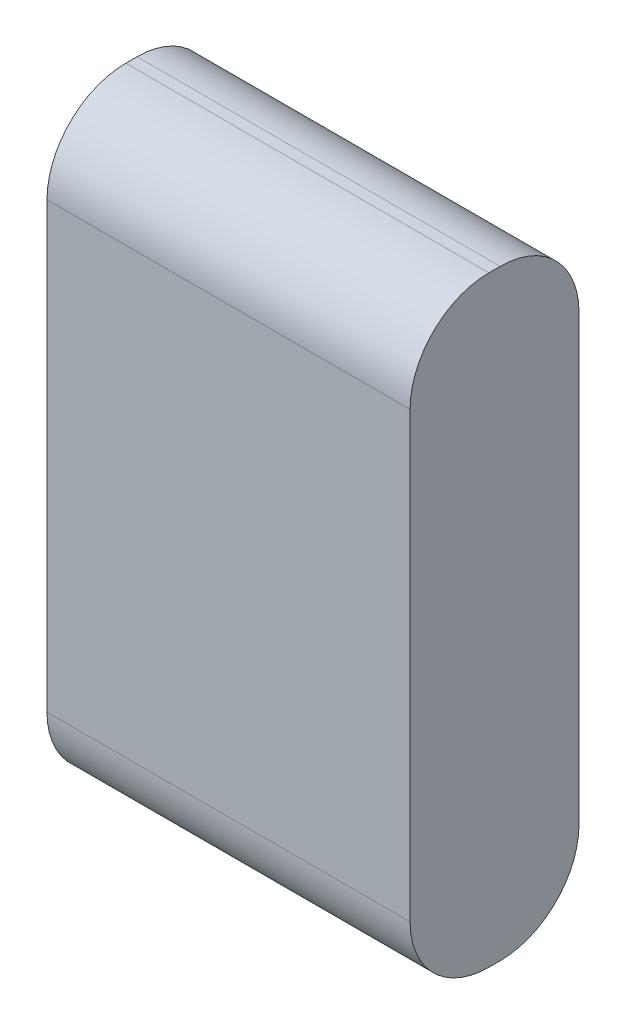
ISO-10303-21;
HEADER;
FILE_DESCRIPTION(('STEP AP214'),'2;1');
FILE_NAME('part.step','',(''),(''),'','','');
FILE_SCHEMA(('AUTOMOTIVE_DESIGN { 1 0 10303 214 1 1 1 1 }'));
ENDSEC;
DATA;
#1=APPLICATION_CONTEXT('core data for automotive mechanical design processes');
#2=APPLICATION_PROTOCOL_DEFINITION('international standard','automotive_design',2000,#1);
#3=PRODUCT_CONTEXT('',#1,'mechanical');
#4=PRODUCT('Part','Part','',(#3));
#5=PRODUCT_RELATED_PRODUCT_CATEGORY('part','',(#4));
#6=PRODUCT_DEFINITION_FORMATION('','',#4);
#7=PRODUCT_DEFINITION_CONTEXT('part definition',#1,'design');
#8=PRODUCT_DEFINITION('design','',#6,#7);
#9=PRODUCT_DEFINITION_SHAPE('','',#8);
#10=(LENGTH_UNIT() NAMED_UNIT(*) SI_UNIT(.MILLI.,.METRE.));
#11=(NAMED_UNIT(*) PLANE_ANGLE_UNIT() SI_UNIT($,.RADIAN.));
#12=(NAMED_UNIT(*) SI_UNIT($,.STERADIAN.) SOLID_ANGLE_UNIT());
#13=UNCERTAINTY_MEASURE_WITH_UNIT(LENGTH_MEASURE(1.E-05),#10,'distance_accuracy_value','');
#14=(GEOMETRIC_REPRESENTATION_CONTEXT(3) GLOBAL_UNCERTAINTY_ASSIGNED_CONTEXT((#13)) GLOBAL_UNIT_ASSIGNED_CONTEXT((#10,
#11,#12)) REPRESENTATION_CONTEXT('',''));
#15=CARTESIAN_POINT('',(0.,0.,0.));
#16=DIRECTION('',(0.,0.,1.));
#17=DIRECTION('',(1.,0.,0.));
#18=AXIS2_PLACEMENT_3D('',#15,#16,#17);
#19=CARTESIAN_POINT('',(0.,133.5,0.));
#20=DIRECTION('',(1.,0.,0.));
#21=DIRECTION('',(0.,0.,-1.));
#22=AXIS2_PLACEMENT_3D('',#19,#20,#21);
#23=PLANE('',#22);
#24=DIRECTION('',(0.,-1.,0.));
#25=VECTOR('',#24,1.);
#26=CARTESIAN_POINT('',(0.,133.5,0.));
#27=LINE('',#26,#25);
#28=CARTESIAN_POINT('',(0.,116.,0.));
#29=VERTEX_POINT('',#28);
#30=CARTESIAN_POINT('',(0.,17.5,0.));
#31=VERTEX_POINT('',#30);
#32=EDGE_CURVE('E127',#29,#31,#27,.T.);
#33=ORIENTED_EDGE('',*,*,#32,.F.);
#34=CARTESIAN_POINT('',(0.,116.,-17.5));
#35=DIRECTION('',(1.,0.,0.));
#36=DIRECTION('',(0.,0.,-1.));
#37=AXIS2_PLACEMENT_3D('',#34,#35,#36);
#38=CIRCLE('',#37,17.5);
#39=CARTESIAN_POINT('',(0.,133.5,-17.5));
#40=VERTEX_POINT('',#39);
#41=EDGE_CURVE('E114',#29,#40,#38,.F.);
#42=ORIENTED_EDGE('',*,*,#41,.T.);
#43=DIRECTION('',(0.,0.,1.));
#44=VECTOR('',#43,1.);
#45=CARTESIAN_POINT('',(0.,133.5,0.));
#46=LINE('',#45,#44);
#47=CARTESIAN_POINT('',(0.,133.5,-20.));
#48=VERTEX_POINT('',#47);
#49=EDGE_CURVE('E122',#48,#40,#46,.T.);
#50=ORIENTED_EDGE('',*,*,#49,.F.);
#51=CARTESIAN_POINT('',(0.,116.,-20.));
#52=DIRECTION('',(1.,0.,0.));
#53=DIRECTION('',(0.,0.,-1.));
#54=AXIS2_PLACEMENT_3D('',#51,#52,#53);
#55=CIRCLE('',#54,17.5);
#56=CARTESIAN_POINT('',(0.,116.,-37.5));
#57=VERTEX_POINT('',#56);
#58=EDGE_CURVE('E66',#48,#57,#55,.F.);
#59=ORIENTED_EDGE('',*,*,#58,.T.);
#60=DIRECTION('',(0.,-1.,0.));
#61=VECTOR('',#60,1.);
#62=CARTESIAN_POINT('',(0.,133.5,-37.5));
#63=LINE('',#62,#61);
#64=CARTESIAN_POINT('',(0.,17.5,-37.5));
#65=VERTEX_POINT('',#64);
#66=EDGE_CURVE('E133',#57,#65,#63,.T.);
#67=ORIENTED_EDGE('',*,*,#66,.T.);
#68=CARTESIAN_POINT('',(0.,17.5,-20.));
#69=DIRECTION('',(1.,0.,0.));
#70=DIRECTION('',(0.,0.,-1.));
#71=AXIS2_PLACEMENT_3D('',#68,#69,#70);
#72=CIRCLE('',#71,17.5);
#73=CARTESIAN_POINT('',(0.,0.,-20.));
#74=VERTEX_POINT('',#73);
#75=EDGE_CURVE('E58',#65,#74,#72,.F.);
#76=ORIENTED_EDGE('',*,*,#75,.T.);
#77=DIRECTION('',(0.,0.,1.));
#78=VECTOR('',#77,1.);
#79=CARTESIAN_POINT('',(0.,0.,0.));
#80=LINE('',#79,#78);
#81=CARTESIAN_POINT('',(0.,0.,-17.5));
#82=VERTEX_POINT('',#81);
#83=EDGE_CURVE('E136',#74,#82,#80,.T.);
#84=ORIENTED_EDGE('',*,*,#83,.T.);
#85=CARTESIAN_POINT('',(0.,17.5,-17.5));
#86=DIRECTION('',(1.,0.,0.));
#87=DIRECTION('',(0.,0.,-1.));
#88=AXIS2_PLACEMENT_3D('',#85,#86,#87);
#89=CIRCLE('',#88,17.5);
#90=EDGE_CURVE('E115',#82,#31,#89,.F.);
#91=ORIENTED_EDGE('',*,*,#90,.T.);
#92=EDGE_LOOP('',(#33,#42,#50,#59,#67,#76,#84,#91));
#93=FACE_BOUND('',#92,.T.);
#94=ADVANCED_FACE('F43',(#93),#23,.F.);
#95=CARTESIAN_POINT('',(0.,133.5,0.));
#96=DIRECTION('',(0.,0.,-1.));
#97=DIRECTION('',(-1.,0.,0.));
#98=AXIS2_PLACEMENT_3D('',#95,#96,#97);
#99=PLANE('',#98);
#100=DIRECTION('',(0.,-1.,0.));
#101=VECTOR('',#100,1.);
#102=CARTESIAN_POINT('',(80.6,133.5,0.));
#103=LINE('',#102,#101);
#104=CARTESIAN_POINT('',(80.6,116.,0.));
#105=VERTEX_POINT('',#104);
#106=CARTESIAN_POINT('',(80.6,17.5,0.));
#107=VERTEX_POINT('',#106);
#108=EDGE_CURVE('E145',#105,#107,#103,.T.);
#109=ORIENTED_EDGE('',*,*,#108,.F.);
#110=DIRECTION('',(1.,0.,0.));
#111=VECTOR('',#110,1.);
#112=CARTESIAN_POINT('',(0.,116.,0.));
#113=LINE('',#112,#111);
#114=EDGE_CURVE('E162',#105,#29,#113,.F.);
#115=ORIENTED_EDGE('',*,*,#114,.T.);
#116=ORIENTED_EDGE('',*,*,#32,.T.);
#117=DIRECTION('',(1.,0.,0.));
#118=VECTOR('',#117,1.);
#119=CARTESIAN_POINT('',(80.6,17.5,0.));
#120=LINE('',#119,#118);
#121=EDGE_CURVE('E159',#31,#107,#120,.T.);
#122=ORIENTED_EDGE('',*,*,#121,.T.);
#123=EDGE_LOOP('',(#109,#115,#116,#122));
#124=FACE_BOUND('',#123,.T.);
#125=ADVANCED_FACE('F186',(#124),#99,.F.);
#126=CARTESIAN_POINT('',(80.6,133.5,0.));
#127=DIRECTION('',(-1.,0.,0.));
#128=DIRECTION('',(0.,0.,1.));
#129=AXIS2_PLACEMENT_3D('',#126,#127,#128);
#130=PLANE('',#129);
#131=DIRECTION('',(0.,0.,-1.));
#132=VECTOR('',#131,1.);
#133=CARTESIAN_POINT('',(80.6,133.5,0.));
#134=LINE('',#133,#132);
#135=CARTESIAN_POINT('',(80.6,133.5,-17.5));
#136=VERTEX_POINT('',#135);
#137=CARTESIAN_POINT('',(80.6,133.5,-20.));
#138=VERTEX_POINT('',#137);
#139=EDGE_CURVE('E125',#136,#138,#134,.T.);
#140=ORIENTED_EDGE('',*,*,#139,.F.);
#141=CARTESIAN_POINT('',(80.6,116.,-17.5));
#142=DIRECTION('',(-1.,0.,0.));
#143=DIRECTION('',(0.,0.,1.));
#144=AXIS2_PLACEMENT_3D('',#141,#142,#143);
#145=CIRCLE('',#144,17.5);
#146=EDGE_CURVE('E157',#136,#105,#145,.F.);
#147=ORIENTED_EDGE('',*,*,#146,.T.);
#148=ORIENTED_EDGE('',*,*,#108,.T.);
#149=CARTESIAN_POINT('',(80.6,17.5,-17.5));
#150=DIRECTION('',(-1.,0.,0.));
#151=DIRECTION('',(0.,0.,1.));
#152=AXIS2_PLACEMENT_3D('',#149,#150,#151);
#153=CIRCLE('',#152,17.5);
#154=CARTESIAN_POINT('',(80.6,0.,-17.5));
#155=VERTEX_POINT('',#154);
#156=EDGE_CURVE('E153',#107,#155,#153,.F.);
#157=ORIENTED_EDGE('',*,*,#156,.T.);
#158=DIRECTION('',(0.,0.,-1.));
#159=VECTOR('',#158,1.);
#160=CARTESIAN_POINT('',(80.6,0.,0.));
#161=LINE('',#160,#159);
#162=CARTESIAN_POINT('',(80.6,0.,-20.));
#163=VERTEX_POINT('',#162);
#164=EDGE_CURVE('E131',#155,#163,#161,.T.);
#165=ORIENTED_EDGE('',*,*,#164,.T.);
#166=CARTESIAN_POINT('',(80.6,17.5,-20.));
#167=DIRECTION('',(-1.,0.,0.));
#168=DIRECTION('',(0.,0.,1.));
#169=AXIS2_PLACEMENT_3D('',#166,#167,#168);
#170=CIRCLE('',#169,17.5);
#171=CARTESIAN_POINT('',(80.6,17.5,-37.5));
#172=VERTEX_POINT('',#171);
#173=EDGE_CURVE('E151',#163,#172,#170,.F.);
#174=ORIENTED_EDGE('',*,*,#173,.T.);
#175=DIRECTION('',(0.,-1.,0.));
#176=VECTOR('',#175,1.);
#177=CARTESIAN_POINT('',(80.6,133.5,-37.5));
#178=LINE('',#177,#176);
#179=CARTESIAN_POINT('',(80.6,116.,-37.5));
#180=VERTEX_POINT('',#179);
#181=EDGE_CURVE('E142',#180,#172,#178,.T.);
#182=ORIENTED_EDGE('',*,*,#181,.F.);
#183=CARTESIAN_POINT('',(80.6,116.,-20.));
#184=DIRECTION('',(-1.,0.,0.));
#185=DIRECTION('',(0.,0.,1.));
#186=AXIS2_PLACEMENT_3D('',#183,#184,#185);
#187=CIRCLE('',#186,17.5);
#188=EDGE_CURVE('E155',#180,#138,#187,.F.);
#189=ORIENTED_EDGE('',*,*,#188,.T.);
#190=EDGE_LOOP('',(#140,#147,#148,#157,#165,#174,#182,#189));
#191=FACE_BOUND('',#190,.T.);
#192=ADVANCED_FACE('F176',(#191),#130,.F.);
#193=CARTESIAN_POINT('',(0.,133.5,-37.5));
#194=DIRECTION('',(0.,0.,1.));
#195=DIRECTION('',(1.,0.,0.));
#196=AXIS2_PLACEMENT_3D('',#193,#194,#195);
#197=PLANE('',#196);
#198=ORIENTED_EDGE('',*,*,#66,.F.);
#199=DIRECTION('',(-1.,0.,0.));
#200=VECTOR('',#199,1.);
#201=CARTESIAN_POINT('',(0.,116.,-37.5));
#202=LINE('',#201,#200);
#203=EDGE_CURVE('E113',#57,#180,#202,.F.);
#204=ORIENTED_EDGE('',*,*,#203,.T.);
#205=ORIENTED_EDGE('',*,*,#181,.T.);
#206=DIRECTION('',(-1.,0.,0.));
#207=VECTOR('',#206,1.);
#208=CARTESIAN_POINT('',(0.,17.5,-37.5));
#209=LINE('',#208,#207);
#210=EDGE_CURVE('E167',#172,#65,#209,.T.);
#211=ORIENTED_EDGE('',*,*,#210,.T.);
#212=EDGE_LOOP('',(#198,#204,#205,#211));
#213=FACE_BOUND('',#212,.T.);
#214=ADVANCED_FACE('F179',(#213),#197,.F.);
#215=CARTESIAN_POINT('',(0.,133.5,0.));
#216=DIRECTION('',(0.,-1.,0.));
#217=DIRECTION('',(0.,0.,-1.));
#218=AXIS2_PLACEMENT_3D('',#215,#216,#217);
#219=PLANE('',#218);
#220=ORIENTED_EDGE('',*,*,#49,.T.);
#221=DIRECTION('',(1.,0.,0.));
#222=VECTOR('',#221,1.);
#223=CARTESIAN_POINT('',(0.,133.5,-17.5));
#224=LINE('',#223,#222);
#225=EDGE_CURVE('E126',#40,#136,#224,.T.);
#226=ORIENTED_EDGE('',*,*,#225,.T.);
#227=ORIENTED_EDGE('',*,*,#139,.T.);
#228=DIRECTION('',(-1.,0.,0.));
#229=VECTOR('',#228,1.);
#230=CARTESIAN_POINT('',(0.,133.5,-20.));
#231=LINE('',#230,#229);
#232=EDGE_CURVE('E112',#138,#48,#231,.T.);
#233=ORIENTED_EDGE('',*,*,#232,.T.);
#234=EDGE_LOOP('',(#220,#226,#227,#233));
#235=FACE_BOUND('',#234,.T.);
#236=ADVANCED_FACE('F120',(#235),#219,.F.);
#237=CARTESIAN_POINT('',(0.,0.,0.));
#238=DIRECTION('',(0.,-1.,0.));
#239=DIRECTION('',(0.,0.,-1.));
#240=AXIS2_PLACEMENT_3D('',#237,#238,#239);
#241=PLANE('',#240);
#242=ORIENTED_EDGE('',*,*,#164,.F.);
#243=DIRECTION('',(1.,0.,0.));
#244=VECTOR('',#243,1.);
#245=CARTESIAN_POINT('',(0.,0.,-17.5));
#246=LINE('',#245,#244);
#247=EDGE_CURVE('E11',#155,#82,#246,.F.);
#248=ORIENTED_EDGE('',*,*,#247,.T.);
#249=ORIENTED_EDGE('',*,*,#83,.F.);
#250=DIRECTION('',(-1.,0.,0.));
#251=VECTOR('',#250,1.);
#252=CARTESIAN_POINT('',(80.6,0.,-20.));
#253=LINE('',#252,#251);
#254=EDGE_CURVE('E51',#74,#163,#253,.F.);
#255=ORIENTED_EDGE('',*,*,#254,.T.);
#256=EDGE_LOOP('',(#242,#248,#249,#255));
#257=FACE_BOUND('',#256,.T.);
#258=ADVANCED_FACE('F172',(#257),#241,.T.);
#259=CARTESIAN_POINT('',(0.,116.,-17.5));
#260=DIRECTION('',(1.,0.,0.));
#261=DIRECTION('',(0.,0.,-1.));
#262=AXIS2_PLACEMENT_3D('',#259,#260,#261);
#263=CYLINDRICAL_SURFACE('',#262,17.5);
#264=ORIENTED_EDGE('',*,*,#41,.F.);
#265=ORIENTED_EDGE('',*,*,#114,.F.);
#266=ORIENTED_EDGE('',*,*,#146,.F.);
#267=ORIENTED_EDGE('',*,*,#225,.F.);
#268=EDGE_LOOP('',(#264,#265,#266,#267));
#269=FACE_BOUND('',#268,.T.);
#270=ADVANCED_FACE('F189',(#269),#263,.T.);
#271=CARTESIAN_POINT('',(0.,116.,-20.));
#272=DIRECTION('',(-1.,0.,0.));
#273=DIRECTION('',(0.,0.,1.));
#274=AXIS2_PLACEMENT_3D('',#271,#272,#273);
#275=CYLINDRICAL_SURFACE('',#274,17.5);
#276=ORIENTED_EDGE('',*,*,#188,.F.);
#277=ORIENTED_EDGE('',*,*,#203,.F.);
#278=ORIENTED_EDGE('',*,*,#58,.F.);
#279=ORIENTED_EDGE('',*,*,#232,.F.);
#280=EDGE_LOOP('',(#276,#277,#278,#279));
#281=FACE_BOUND('',#280,.T.);
#282=ADVANCED_FACE('F111',(#281),#275,.T.);
#283=CARTESIAN_POINT('',(0.,17.5,-17.5));
#284=DIRECTION('',(-1.,0.,0.));
#285=DIRECTION('',(0.,0.,1.));
#286=AXIS2_PLACEMENT_3D('',#283,#284,#285);
#287=CYLINDRICAL_SURFACE('',#286,17.5);
#288=ORIENTED_EDGE('',*,*,#90,.F.);
#289=ORIENTED_EDGE('',*,*,#247,.F.);
#290=ORIENTED_EDGE('',*,*,#156,.F.);
#291=ORIENTED_EDGE('',*,*,#121,.F.);
#292=EDGE_LOOP('',(#288,#289,#290,#291));
#293=FACE_BOUND('',#292,.T.);
#294=ADVANCED_FACE('F183',(#293),#287,.T.);
#295=CARTESIAN_POINT('',(0.,17.5,-20.));
#296=DIRECTION('',(1.,0.,0.));
#297=DIRECTION('',(0.,0.,-1.));
#298=AXIS2_PLACEMENT_3D('',#295,#296,#297);
#299=CYLINDRICAL_SURFACE('',#298,17.5);
#300=ORIENTED_EDGE('',*,*,#173,.F.);
#301=ORIENTED_EDGE('',*,*,#254,.F.);
#302=ORIENTED_EDGE('',*,*,#75,.F.);
#303=ORIENTED_EDGE('',*,*,#210,.F.);
#304=EDGE_LOOP('',(#300,#301,#302,#303));
#305=FACE_BOUND('',#304,.T.);
#306=ADVANCED_FACE('F45',(#305),#299,.T.);
#307=CLOSED_SHELL('',(#94,#125,#192,#214,#236,#258,#270,#282,#294,#306));
#308=MANIFOLD_SOLID_BREP('B2',#307);
#309=ADVANCED_BREP_SHAPE_REPRESENTATION('',(#18,#308),#14);
#310=SHAPE_DEFINITION_REPRESENTATION(#9,#309);
ENDSEC;
END-ISO-10303-21;
